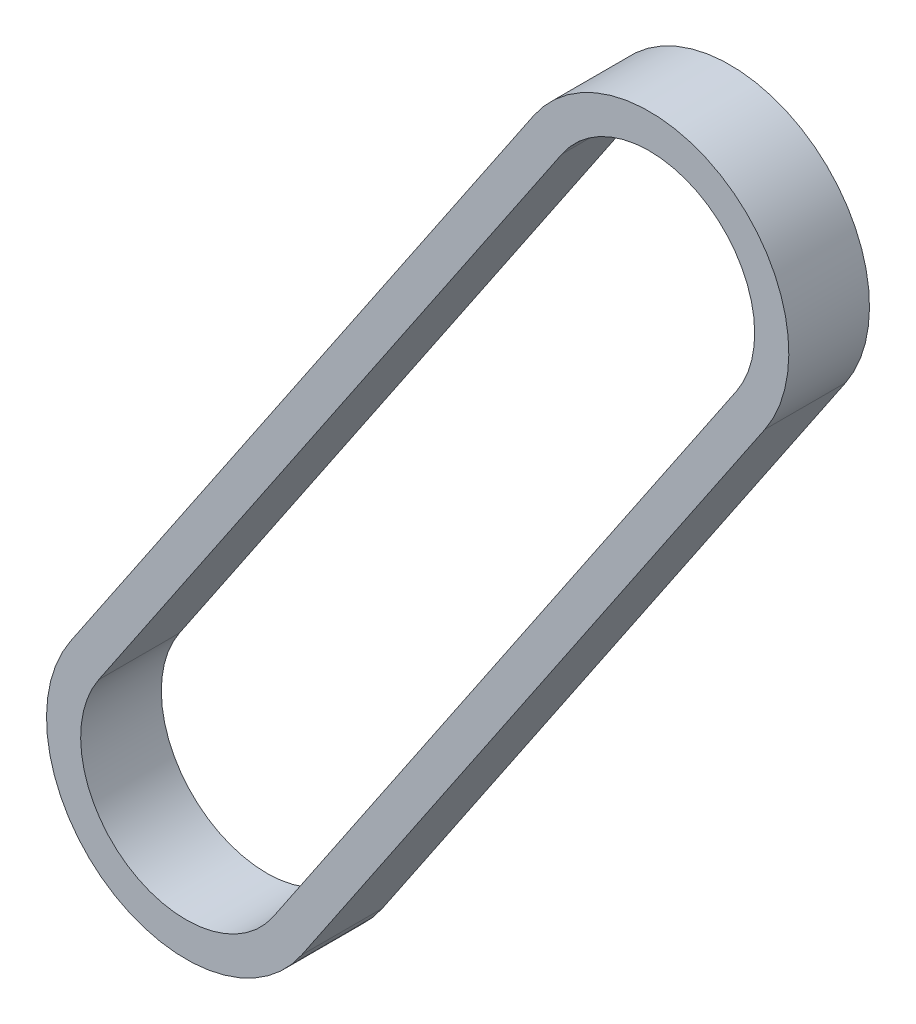
ISO-10303-21;
HEADER;
FILE_DESCRIPTION(('STEP AP214'),'2;1');
FILE_NAME('part.step','',(''),(''),'','','');
FILE_SCHEMA(('AUTOMOTIVE_DESIGN { 1 0 10303 214 1 1 1 1 }'));
ENDSEC;
DATA;
#1=APPLICATION_CONTEXT('core data for automotive mechanical design processes');
#2=APPLICATION_PROTOCOL_DEFINITION('international standard','automotive_design',2000,#1);
#3=PRODUCT_CONTEXT('',#1,'mechanical');
#4=PRODUCT('Part','Part','',(#3));
#5=PRODUCT_RELATED_PRODUCT_CATEGORY('part','',(#4));
#6=PRODUCT_DEFINITION_FORMATION('','',#4);
#7=PRODUCT_DEFINITION_CONTEXT('part definition',#1,'design');
#8=PRODUCT_DEFINITION('design','',#6,#7);
#9=PRODUCT_DEFINITION_SHAPE('','',#8);
#10=(LENGTH_UNIT() NAMED_UNIT(*) SI_UNIT(.MILLI.,.METRE.));
#11=(NAMED_UNIT(*) PLANE_ANGLE_UNIT() SI_UNIT($,.RADIAN.));
#12=(NAMED_UNIT(*) SI_UNIT($,.STERADIAN.) SOLID_ANGLE_UNIT());
#13=UNCERTAINTY_MEASURE_WITH_UNIT(LENGTH_MEASURE(1.E-05),#10,'distance_accuracy_value','');
#14=(GEOMETRIC_REPRESENTATION_CONTEXT(3) GLOBAL_UNCERTAINTY_ASSIGNED_CONTEXT((#13)) GLOBAL_UNIT_ASSIGNED_CONTEXT((#10,
#11,#12)) REPRESENTATION_CONTEXT('',''));
#15=CARTESIAN_POINT('',(0.,0.,0.));
#16=DIRECTION('',(0.,0.,1.));
#17=DIRECTION('',(1.,0.,0.));
#18=AXIS2_PLACEMENT_3D('',#15,#16,#17);
#19=CARTESIAN_POINT('',(0.,0.,9.));
#20=DIRECTION('',(0.,0.,-1.));
#21=DIRECTION('',(-1.,0.,0.));
#22=AXIS2_PLACEMENT_3D('',#19,#20,#21);
#23=PLANE('',#22);
#24=CARTESIAN_POINT('',(0.,0.,9.));
#25=DIRECTION('',(0.,0.,-1.));
#26=DIRECTION('',(-1.,0.,0.));
#27=AXIS2_PLACEMENT_3D('',#24,#25,#26);
#28=CIRCLE('',#27,15.5630935922472);
#29=CARTESIAN_POINT('',(-12.9023893331636,8.70277149283569,9.));
#30=VERTEX_POINT('',#29);
#31=CARTESIAN_POINT('',(12.9023893331636,-8.70277149283569,9.));
#32=VERTEX_POINT('',#31);
#33=EDGE_CURVE('E166',#30,#32,#28,.F.);
#34=ORIENTED_EDGE('',*,*,#33,.T.);
#35=DIRECTION('',(0.559192903470746,0.829037572555042,0.));
#36=VECTOR('',#35,1.);
#37=CARTESIAN_POINT('',(12.9023893331636,-8.70277149283569,9.));
#38=LINE('',#37,#36);
#39=CARTESIAN_POINT('',(64.5922231824007,67.9305586409521,9.));
#40=VERTEX_POINT('',#39);
#41=EDGE_CURVE('E169',#32,#40,#38,.T.);
#42=ORIENTED_EDGE('',*,*,#41,.T.);
#43=CARTESIAN_POINT('',(51.6898338492371,76.6333301337878,9.));
#44=DIRECTION('',(0.,0.,-1.));
#45=DIRECTION('',(-1.,0.,0.));
#46=AXIS2_PLACEMENT_3D('',#43,#44,#45);
#47=CIRCLE('',#46,15.5630935922472);
#48=CARTESIAN_POINT('',(38.7874445160736,85.3361016266235,9.));
#49=VERTEX_POINT('',#48);
#50=EDGE_CURVE('E172',#40,#49,#47,.F.);
#51=ORIENTED_EDGE('',*,*,#50,.T.);
#52=DIRECTION('',(-0.559192903470746,-0.829037572555042,0.));
#53=VECTOR('',#52,1.);
#54=CARTESIAN_POINT('',(-12.9023893331636,8.70277149283568,9.));
#55=LINE('',#54,#53);
#56=EDGE_CURVE('E174',#49,#30,#55,.T.);
#57=ORIENTED_EDGE('',*,*,#56,.T.);
#58=EDGE_LOOP('',(#34,#42,#51,#57));
#59=FACE_BOUND('',#58,.T.);
#60=CARTESIAN_POINT('',(0.,0.,9.));
#61=DIRECTION('',(0.,0.,-1.));
#62=DIRECTION('',(-1.,0.,0.));
#63=AXIS2_PLACEMENT_3D('',#60,#61,#62);
#64=CIRCLE('',#63,11.7530935922472);
#65=CARTESIAN_POINT('',(-9.74375618172886,6.57224653061214,9.));
#66=VERTEX_POINT('',#65);
#67=CARTESIAN_POINT('',(9.74375618172885,-6.57224653061214,9.));
#68=VERTEX_POINT('',#67);
#69=EDGE_CURVE('E130',#66,#68,#64,.F.);
#70=ORIENTED_EDGE('',*,*,#69,.F.);
#71=DIRECTION('',(-0.559192903470746,-0.829037572555042,0.));
#72=VECTOR('',#71,1.);
#73=CARTESIAN_POINT('',(-9.74375618172886,6.57224653061215,9.));
#74=LINE('',#73,#72);
#75=CARTESIAN_POINT('',(41.9460776675083,83.2055766644,9.));
#76=VERTEX_POINT('',#75);
#77=EDGE_CURVE('E152',#76,#66,#74,.T.);
#78=ORIENTED_EDGE('',*,*,#77,.F.);
#79=CARTESIAN_POINT('',(51.6898338492371,76.6333301337878,9.));
#80=DIRECTION('',(0.,0.,-1.));
#81=DIRECTION('',(-1.,0.,0.));
#82=AXIS2_PLACEMENT_3D('',#79,#80,#81);
#83=CIRCLE('',#82,11.7530935922472);
#84=CARTESIAN_POINT('',(61.433590030966,70.0610836031757,9.));
#85=VERTEX_POINT('',#84);
#86=EDGE_CURVE('E150',#85,#76,#83,.F.);
#87=ORIENTED_EDGE('',*,*,#86,.F.);
#88=DIRECTION('',(0.559192903470746,0.829037572555042,0.));
#89=VECTOR('',#88,1.);
#90=CARTESIAN_POINT('',(9.74375618172885,-6.57224653061214,9.));
#91=LINE('',#90,#89);
#92=EDGE_CURVE('E138',#68,#85,#91,.T.);
#93=ORIENTED_EDGE('',*,*,#92,.F.);
#94=EDGE_LOOP('',(#70,#78,#87,#93));
#95=FACE_BOUND('',#94,.T.);
#96=ADVANCED_FACE('F65',(#59,#95),#23,.F.);
#97=CARTESIAN_POINT('',(0.,0.,0.));
#98=DIRECTION('',(0.,0.,-1.));
#99=DIRECTION('',(-1.,0.,0.));
#100=AXIS2_PLACEMENT_3D('',#97,#98,#99);
#101=PLANE('',#100);
#102=CARTESIAN_POINT('',(0.,0.,0.));
#103=DIRECTION('',(0.,0.,-1.));
#104=DIRECTION('',(-1.,0.,0.));
#105=AXIS2_PLACEMENT_3D('',#102,#103,#104);
#106=CIRCLE('',#105,15.5630935922472);
#107=CARTESIAN_POINT('',(-12.9023893331636,8.70277149283569,0.));
#108=VERTEX_POINT('',#107);
#109=CARTESIAN_POINT('',(12.9023893331636,-8.70277149283569,0.));
#110=VERTEX_POINT('',#109);
#111=EDGE_CURVE('E146',#108,#110,#106,.F.);
#112=ORIENTED_EDGE('',*,*,#111,.F.);
#113=DIRECTION('',(-0.559192903470746,-0.829037572555042,0.));
#114=VECTOR('',#113,1.);
#115=CARTESIAN_POINT('',(-12.9023893331636,8.70277149283568,0.));
#116=LINE('',#115,#114);
#117=CARTESIAN_POINT('',(38.7874445160736,85.3361016266235,0.));
#118=VERTEX_POINT('',#117);
#119=EDGE_CURVE('E170',#118,#108,#116,.T.);
#120=ORIENTED_EDGE('',*,*,#119,.F.);
#121=CARTESIAN_POINT('',(51.6898338492371,76.6333301337878,0.));
#122=DIRECTION('',(0.,0.,-1.));
#123=DIRECTION('',(-1.,0.,0.));
#124=AXIS2_PLACEMENT_3D('',#121,#122,#123);
#125=CIRCLE('',#124,15.5630935922472);
#126=CARTESIAN_POINT('',(64.5922231824007,67.9305586409521,0.));
#127=VERTEX_POINT('',#126);
#128=EDGE_CURVE('E181',#127,#118,#125,.F.);
#129=ORIENTED_EDGE('',*,*,#128,.F.);
#130=DIRECTION('',(0.559192903470746,0.829037572555042,0.));
#131=VECTOR('',#130,1.);
#132=CARTESIAN_POINT('',(12.9023893331636,-8.70277149283569,0.));
#133=LINE('',#132,#131);
#134=EDGE_CURVE('E179',#110,#127,#133,.T.);
#135=ORIENTED_EDGE('',*,*,#134,.F.);
#136=EDGE_LOOP('',(#112,#120,#129,#135));
#137=FACE_BOUND('',#136,.T.);
#138=DIRECTION('',(-0.559192903470746,-0.829037572555042,0.));
#139=VECTOR('',#138,1.);
#140=CARTESIAN_POINT('',(-9.74375618172886,6.57224653061215,0.));
#141=LINE('',#140,#139);
#142=CARTESIAN_POINT('',(41.9460776675083,83.2055766644,0.));
#143=VERTEX_POINT('',#142);
#144=CARTESIAN_POINT('',(-9.74375618172886,6.57224653061214,0.));
#145=VERTEX_POINT('',#144);
#146=EDGE_CURVE('E139',#143,#145,#141,.T.);
#147=ORIENTED_EDGE('',*,*,#146,.T.);
#148=CARTESIAN_POINT('',(0.,0.,0.));
#149=DIRECTION('',(0.,0.,-1.));
#150=DIRECTION('',(-1.,0.,0.));
#151=AXIS2_PLACEMENT_3D('',#148,#149,#150);
#152=CIRCLE('',#151,11.7530935922472);
#153=CARTESIAN_POINT('',(9.74375618172885,-6.57224653061214,0.));
#154=VERTEX_POINT('',#153);
#155=EDGE_CURVE('E88',#145,#154,#152,.F.);
#156=ORIENTED_EDGE('',*,*,#155,.T.);
#157=DIRECTION('',(0.559192903470746,0.829037572555042,0.));
#158=VECTOR('',#157,1.);
#159=CARTESIAN_POINT('',(9.74375618172885,-6.57224653061214,0.));
#160=LINE('',#159,#158);
#161=CARTESIAN_POINT('',(61.433590030966,70.0610836031757,0.));
#162=VERTEX_POINT('',#161);
#163=EDGE_CURVE('E145',#154,#162,#160,.T.);
#164=ORIENTED_EDGE('',*,*,#163,.T.);
#165=CARTESIAN_POINT('',(51.6898338492371,76.6333301337878,0.));
#166=DIRECTION('',(0.,0.,-1.));
#167=DIRECTION('',(-1.,0.,0.));
#168=AXIS2_PLACEMENT_3D('',#165,#166,#167);
#169=CIRCLE('',#168,11.7530935922472);
#170=EDGE_CURVE('E158',#162,#143,#169,.F.);
#171=ORIENTED_EDGE('',*,*,#170,.T.);
#172=EDGE_LOOP('',(#147,#156,#164,#171));
#173=FACE_BOUND('',#172,.T.);
#174=ADVANCED_FACE('F199',(#137,#173),#101,.T.);
#175=CARTESIAN_POINT('',(0.,0.,9.));
#176=DIRECTION('',(0.,0.,-1.));
#177=DIRECTION('',(-1.,0.,0.));
#178=AXIS2_PLACEMENT_3D('',#175,#176,#177);
#179=CYLINDRICAL_SURFACE('',#178,15.5630935922472);
#180=ORIENTED_EDGE('',*,*,#111,.T.);
#181=DIRECTION('',(0.,0.,-1.));
#182=VECTOR('',#181,1.);
#183=CARTESIAN_POINT('',(12.9023893331636,-8.70277149283569,9.));
#184=LINE('',#183,#182);
#185=EDGE_CURVE('E12',#32,#110,#184,.T.);
#186=ORIENTED_EDGE('',*,*,#185,.F.);
#187=ORIENTED_EDGE('',*,*,#33,.F.);
#188=DIRECTION('',(0.,0.,-1.));
#189=VECTOR('',#188,1.);
#190=CARTESIAN_POINT('',(-12.9023893331636,8.70277149283569,9.));
#191=LINE('',#190,#189);
#192=EDGE_CURVE('E176',#30,#108,#191,.T.);
#193=ORIENTED_EDGE('',*,*,#192,.T.);
#194=EDGE_LOOP('',(#180,#186,#187,#193));
#195=FACE_BOUND('',#194,.T.);
#196=ADVANCED_FACE('F67',(#195),#179,.T.);
#197=CARTESIAN_POINT('',(12.9023893331636,-8.70277149283569,9.));
#198=DIRECTION('',(-0.829037572555042,0.559192903470746,0.));
#199=DIRECTION('',(-0.559192903470746,-0.829037572555042,0.));
#200=AXIS2_PLACEMENT_3D('',#197,#198,#199);
#201=PLANE('',#200);
#202=ORIENTED_EDGE('',*,*,#134,.T.);
#203=DIRECTION('',(0.,0.,-1.));
#204=VECTOR('',#203,1.);
#205=CARTESIAN_POINT('',(64.5922231824007,67.9305586409521,9.));
#206=LINE('',#205,#204);
#207=EDGE_CURVE('E73',#40,#127,#206,.T.);
#208=ORIENTED_EDGE('',*,*,#207,.F.);
#209=ORIENTED_EDGE('',*,*,#41,.F.);
#210=ORIENTED_EDGE('',*,*,#185,.T.);
#211=EDGE_LOOP('',(#202,#208,#209,#210));
#212=FACE_BOUND('',#211,.T.);
#213=ADVANCED_FACE('F209',(#212),#201,.F.);
#214=CARTESIAN_POINT('',(51.6898338492371,76.6333301337878,9.));
#215=DIRECTION('',(0.,0.,-1.));
#216=DIRECTION('',(-1.,0.,0.));
#217=AXIS2_PLACEMENT_3D('',#214,#215,#216);
#218=CYLINDRICAL_SURFACE('',#217,15.5630935922472);
#219=ORIENTED_EDGE('',*,*,#128,.T.);
#220=DIRECTION('',(0.,0.,-1.));
#221=VECTOR('',#220,1.);
#222=CARTESIAN_POINT('',(38.7874445160736,85.3361016266235,9.));
#223=LINE('',#222,#221);
#224=EDGE_CURVE('E186',#49,#118,#223,.T.);
#225=ORIENTED_EDGE('',*,*,#224,.F.);
#226=ORIENTED_EDGE('',*,*,#50,.F.);
#227=ORIENTED_EDGE('',*,*,#207,.T.);
#228=EDGE_LOOP('',(#219,#225,#226,#227));
#229=FACE_BOUND('',#228,.T.);
#230=ADVANCED_FACE('F193',(#229),#218,.T.);
#231=CARTESIAN_POINT('',(-12.9023893331636,8.70277149283568,9.));
#232=DIRECTION('',(0.829037572555042,-0.559192903470746,0.));
#233=DIRECTION('',(0.559192903470746,0.829037572555042,0.));
#234=AXIS2_PLACEMENT_3D('',#231,#232,#233);
#235=PLANE('',#234);
#236=ORIENTED_EDGE('',*,*,#119,.T.);
#237=ORIENTED_EDGE('',*,*,#192,.F.);
#238=ORIENTED_EDGE('',*,*,#56,.F.);
#239=ORIENTED_EDGE('',*,*,#224,.T.);
#240=EDGE_LOOP('',(#236,#237,#238,#239));
#241=FACE_BOUND('',#240,.T.);
#242=ADVANCED_FACE('F203',(#241),#235,.F.);
#243=CARTESIAN_POINT('',(0.,0.,9.));
#244=DIRECTION('',(0.,0.,-1.));
#245=DIRECTION('',(-1.,0.,0.));
#246=AXIS2_PLACEMENT_3D('',#243,#244,#245);
#247=CYLINDRICAL_SURFACE('',#246,11.7530935922472);
#248=ORIENTED_EDGE('',*,*,#155,.F.);
#249=DIRECTION('',(0.,0.,-1.));
#250=VECTOR('',#249,1.);
#251=CARTESIAN_POINT('',(-9.74375618172886,6.57224653061214,9.));
#252=LINE('',#251,#250);
#253=EDGE_CURVE('E134',#66,#145,#252,.T.);
#254=ORIENTED_EDGE('',*,*,#253,.F.);
#255=ORIENTED_EDGE('',*,*,#69,.T.);
#256=DIRECTION('',(0.,0.,-1.));
#257=VECTOR('',#256,1.);
#258=CARTESIAN_POINT('',(9.74375618172885,-6.57224653061214,9.));
#259=LINE('',#258,#257);
#260=EDGE_CURVE('E133',#68,#154,#259,.T.);
#261=ORIENTED_EDGE('',*,*,#260,.T.);
#262=EDGE_LOOP('',(#248,#254,#255,#261));
#263=FACE_BOUND('',#262,.T.);
#264=ADVANCED_FACE('F132',(#263),#247,.F.);
#265=CARTESIAN_POINT('',(9.74375618172885,-6.57224653061214,9.));
#266=DIRECTION('',(-0.829037572555042,0.559192903470746,0.));
#267=DIRECTION('',(-0.559192903470746,-0.829037572555042,0.));
#268=AXIS2_PLACEMENT_3D('',#265,#266,#267);
#269=PLANE('',#268);
#270=ORIENTED_EDGE('',*,*,#163,.F.);
#271=ORIENTED_EDGE('',*,*,#260,.F.);
#272=ORIENTED_EDGE('',*,*,#92,.T.);
#273=DIRECTION('',(0.,0.,-1.));
#274=VECTOR('',#273,1.);
#275=CARTESIAN_POINT('',(61.433590030966,70.0610836031757,9.));
#276=LINE('',#275,#274);
#277=EDGE_CURVE('E147',#85,#162,#276,.T.);
#278=ORIENTED_EDGE('',*,*,#277,.T.);
#279=EDGE_LOOP('',(#270,#271,#272,#278));
#280=FACE_BOUND('',#279,.T.);
#281=ADVANCED_FACE('F142',(#280),#269,.T.);
#282=CARTESIAN_POINT('',(51.6898338492371,76.6333301337878,9.));
#283=DIRECTION('',(0.,0.,-1.));
#284=DIRECTION('',(-1.,0.,0.));
#285=AXIS2_PLACEMENT_3D('',#282,#283,#284);
#286=CYLINDRICAL_SURFACE('',#285,11.7530935922472);
#287=ORIENTED_EDGE('',*,*,#170,.F.);
#288=ORIENTED_EDGE('',*,*,#277,.F.);
#289=ORIENTED_EDGE('',*,*,#86,.T.);
#290=DIRECTION('',(0.,0.,-1.));
#291=VECTOR('',#290,1.);
#292=CARTESIAN_POINT('',(41.9460776675083,83.2055766644,9.));
#293=LINE('',#292,#291);
#294=EDGE_CURVE('E80',#76,#143,#293,.T.);
#295=ORIENTED_EDGE('',*,*,#294,.T.);
#296=EDGE_LOOP('',(#287,#288,#289,#295));
#297=FACE_BOUND('',#296,.T.);
#298=ADVANCED_FACE('F232',(#297),#286,.F.);
#299=CARTESIAN_POINT('',(-9.74375618172886,6.57224653061215,9.));
#300=DIRECTION('',(0.829037572555042,-0.559192903470746,0.));
#301=DIRECTION('',(0.559192903470746,0.829037572555042,0.));
#302=AXIS2_PLACEMENT_3D('',#299,#300,#301);
#303=PLANE('',#302);
#304=ORIENTED_EDGE('',*,*,#146,.F.);
#305=ORIENTED_EDGE('',*,*,#294,.F.);
#306=ORIENTED_EDGE('',*,*,#77,.T.);
#307=ORIENTED_EDGE('',*,*,#253,.T.);
#308=EDGE_LOOP('',(#304,#305,#306,#307));
#309=FACE_BOUND('',#308,.T.);
#310=ADVANCED_FACE('F236',(#309),#303,.T.);
#311=CLOSED_SHELL('',(#96,#174,#196,#213,#230,#242,#264,#281,#298,#310));
#312=MANIFOLD_SOLID_BREP('B2',#311);
#313=ADVANCED_BREP_SHAPE_REPRESENTATION('',(#18,#312),#14);
#314=SHAPE_DEFINITION_REPRESENTATION(#9,#313);
ENDSEC;
END-ISO-10303-21;
